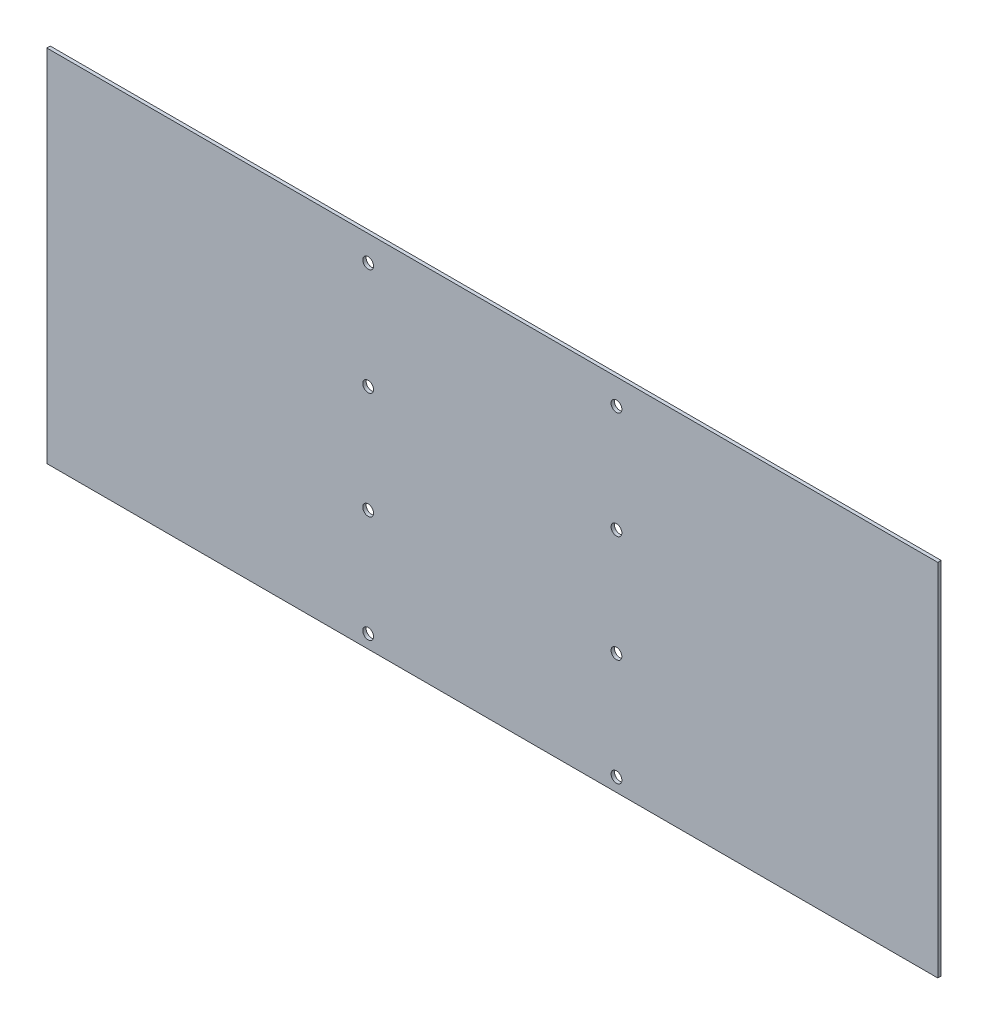
ISO-10303-21;
HEADER;
FILE_DESCRIPTION(('STEP AP214'),'2;1');
FILE_NAME('part.step','',(''),(''),'','','');
FILE_SCHEMA(('AUTOMOTIVE_DESIGN { 1 0 10303 214 1 1 1 1 }'));
ENDSEC;
DATA;
#1=APPLICATION_CONTEXT('core data for automotive mechanical design processes');
#2=APPLICATION_PROTOCOL_DEFINITION('international standard','automotive_design',2000,#1);
#3=PRODUCT_CONTEXT('',#1,'mechanical');
#4=PRODUCT('Part','Part','',(#3));
#5=PRODUCT_RELATED_PRODUCT_CATEGORY('part','',(#4));
#6=PRODUCT_DEFINITION_FORMATION('','',#4);
#7=PRODUCT_DEFINITION_CONTEXT('part definition',#1,'design');
#8=PRODUCT_DEFINITION('design','',#6,#7);
#9=PRODUCT_DEFINITION_SHAPE('','',#8);
#10=(LENGTH_UNIT() NAMED_UNIT(*) SI_UNIT(.MILLI.,.METRE.));
#11=(NAMED_UNIT(*) PLANE_ANGLE_UNIT() SI_UNIT($,.RADIAN.));
#12=(NAMED_UNIT(*) SI_UNIT($,.STERADIAN.) SOLID_ANGLE_UNIT());
#13=UNCERTAINTY_MEASURE_WITH_UNIT(LENGTH_MEASURE(1.E-05),#10,'distance_accuracy_value','');
#14=(GEOMETRIC_REPRESENTATION_CONTEXT(3) GLOBAL_UNCERTAINTY_ASSIGNED_CONTEXT((#13)) GLOBAL_UNIT_ASSIGNED_CONTEXT((#10,
#11,#12)) REPRESENTATION_CONTEXT('',''));
#15=CARTESIAN_POINT('',(0.,0.,0.));
#16=DIRECTION('',(0.,0.,1.));
#17=DIRECTION('',(1.,0.,0.));
#18=AXIS2_PLACEMENT_3D('',#15,#16,#17);
#19=CARTESIAN_POINT('',(-340.928598281418,201.536549165121,-3.175));
#20=DIRECTION('',(-1.,0.,0.));
#21=DIRECTION('',(0.,0.,1.));
#22=AXIS2_PLACEMENT_3D('',#19,#20,#21);
#23=PLANE('',#22);
#24=DIRECTION('',(0.,-1.,0.));
#25=VECTOR('',#24,1.);
#26=CARTESIAN_POINT('',(-340.928598281418,201.536549165121,0.));
#27=LINE('',#26,#25);
#28=CARTESIAN_POINT('',(-340.928598281418,201.536549165121,0.));
#29=VERTEX_POINT('',#28);
#30=CARTESIAN_POINT('',(-340.928598281418,-134.763450834879,0.));
#31=VERTEX_POINT('',#30);
#32=EDGE_CURVE('E105',#29,#31,#27,.T.);
#33=ORIENTED_EDGE('',*,*,#32,.F.);
#34=DIRECTION('',(0.,0.,1.));
#35=VECTOR('',#34,1.);
#36=CARTESIAN_POINT('',(-340.928598281418,201.536549165121,-3.175));
#37=LINE('',#36,#35);
#38=CARTESIAN_POINT('',(-340.928598281418,201.536549165121,-3.175));
#39=VERTEX_POINT('',#38);
#40=EDGE_CURVE('E11',#39,#29,#37,.T.);
#41=ORIENTED_EDGE('',*,*,#40,.F.);
#42=DIRECTION('',(0.,-1.,0.));
#43=VECTOR('',#42,1.);
#44=CARTESIAN_POINT('',(-340.928598281418,201.536549165121,-3.175));
#45=LINE('',#44,#43);
#46=CARTESIAN_POINT('',(-340.928598281418,-134.763450834879,-3.175));
#47=VERTEX_POINT('',#46);
#48=EDGE_CURVE('E98',#39,#47,#45,.T.);
#49=ORIENTED_EDGE('',*,*,#48,.T.);
#50=DIRECTION('',(0.,0.,1.));
#51=VECTOR('',#50,1.);
#52=CARTESIAN_POINT('',(-340.928598281418,-134.763450834879,-3.175));
#53=LINE('',#52,#51);
#54=EDGE_CURVE('E43',#47,#31,#53,.T.);
#55=ORIENTED_EDGE('',*,*,#54,.T.);
#56=EDGE_LOOP('',(#33,#41,#49,#55));
#57=FACE_BOUND('',#56,.T.);
#58=ADVANCED_FACE('F40',(#57),#23,.T.);
#59=CARTESIAN_POINT('',(-340.928598281418,201.536549165121,-3.175));
#60=DIRECTION('',(0.,1.,0.));
#61=DIRECTION('',(0.,0.,1.));
#62=AXIS2_PLACEMENT_3D('',#59,#60,#61);
#63=PLANE('',#62);
#64=DIRECTION('',(-1.,0.,0.));
#65=VECTOR('',#64,1.);
#66=CARTESIAN_POINT('',(-340.928598281418,201.536549165121,0.));
#67=LINE('',#66,#65);
#68=CARTESIAN_POINT('',(491.471401718582,201.536549165121,0.));
#69=VERTEX_POINT('',#68);
#70=EDGE_CURVE('E100',#69,#29,#67,.T.);
#71=ORIENTED_EDGE('',*,*,#70,.F.);
#72=DIRECTION('',(0.,0.,1.));
#73=VECTOR('',#72,1.);
#74=CARTESIAN_POINT('',(491.471401718582,201.536549165121,-3.175));
#75=LINE('',#74,#73);
#76=CARTESIAN_POINT('',(491.471401718582,201.536549165121,-3.175));
#77=VERTEX_POINT('',#76);
#78=EDGE_CURVE('E49',#77,#69,#75,.T.);
#79=ORIENTED_EDGE('',*,*,#78,.F.);
#80=DIRECTION('',(-1.,0.,0.));
#81=VECTOR('',#80,1.);
#82=CARTESIAN_POINT('',(-340.928598281418,201.536549165121,-3.175));
#83=LINE('',#82,#81);
#84=EDGE_CURVE('E95',#77,#39,#83,.T.);
#85=ORIENTED_EDGE('',*,*,#84,.T.);
#86=ORIENTED_EDGE('',*,*,#40,.T.);
#87=EDGE_LOOP('',(#71,#79,#85,#86));
#88=FACE_BOUND('',#87,.T.);
#89=ADVANCED_FACE('F116',(#88),#63,.T.);
#90=CARTESIAN_POINT('',(491.471401718582,201.536549165121,-3.175));
#91=DIRECTION('',(1.,0.,0.));
#92=DIRECTION('',(0.,1.,0.));
#93=AXIS2_PLACEMENT_3D('',#90,#91,#92);
#94=PLANE('',#93);
#95=DIRECTION('',(0.,1.,0.));
#96=VECTOR('',#95,1.);
#97=CARTESIAN_POINT('',(491.471401718582,201.536549165121,0.));
#98=LINE('',#97,#96);
#99=CARTESIAN_POINT('',(491.471401718582,-134.763450834879,0.));
#100=VERTEX_POINT('',#99);
#101=EDGE_CURVE('E90',#100,#69,#98,.T.);
#102=ORIENTED_EDGE('',*,*,#101,.F.);
#103=DIRECTION('',(0.,0.,1.));
#104=VECTOR('',#103,1.);
#105=CARTESIAN_POINT('',(491.471401718582,-134.763450834879,-3.175));
#106=LINE('',#105,#104);
#107=CARTESIAN_POINT('',(491.471401718582,-134.763450834879,-3.175));
#108=VERTEX_POINT('',#107);
#109=EDGE_CURVE('E85',#108,#100,#106,.T.);
#110=ORIENTED_EDGE('',*,*,#109,.F.);
#111=DIRECTION('',(0.,1.,0.));
#112=VECTOR('',#111,1.);
#113=CARTESIAN_POINT('',(491.471401718582,201.536549165121,-3.175));
#114=LINE('',#113,#112);
#115=EDGE_CURVE('E88',#108,#77,#114,.T.);
#116=ORIENTED_EDGE('',*,*,#115,.T.);
#117=ORIENTED_EDGE('',*,*,#78,.T.);
#118=EDGE_LOOP('',(#102,#110,#116,#117));
#119=FACE_BOUND('',#118,.T.);
#120=ADVANCED_FACE('F87',(#119),#94,.T.);
#121=CARTESIAN_POINT('',(-340.928598281418,-134.763450834879,-3.175));
#122=DIRECTION('',(0.,-1.,0.));
#123=DIRECTION('',(0.,0.,-1.));
#124=AXIS2_PLACEMENT_3D('',#121,#122,#123);
#125=PLANE('',#124);
#126=DIRECTION('',(1.,0.,0.));
#127=VECTOR('',#126,1.);
#128=CARTESIAN_POINT('',(-340.928598281418,-134.763450834879,0.));
#129=LINE('',#128,#127);
#130=EDGE_CURVE('E108',#31,#100,#129,.T.);
#131=ORIENTED_EDGE('',*,*,#130,.F.);
#132=ORIENTED_EDGE('',*,*,#54,.F.);
#133=DIRECTION('',(1.,0.,0.));
#134=VECTOR('',#133,1.);
#135=CARTESIAN_POINT('',(-340.928598281418,-134.763450834879,-3.175));
#136=LINE('',#135,#134);
#137=EDGE_CURVE('E94',#47,#108,#136,.T.);
#138=ORIENTED_EDGE('',*,*,#137,.T.);
#139=ORIENTED_EDGE('',*,*,#109,.T.);
#140=EDGE_LOOP('',(#131,#132,#138,#139));
#141=FACE_BOUND('',#140,.T.);
#142=ADVANCED_FACE('F97',(#141),#125,.T.);
#143=CARTESIAN_POINT('',(0.,0.,-3.175));
#144=DIRECTION('',(0.,0.,1.));
#145=DIRECTION('',(1.,0.,0.));
#146=AXIS2_PLACEMENT_3D('',#143,#144,#145);
#147=PLANE('',#146);
#148=CARTESIAN_POINT('',(-40.7285982814178,77.7365491651207,-3.175));
#149=DIRECTION('',(0.,0.,1.));
#150=DIRECTION('',(1.,0.,0.));
#151=AXIS2_PLACEMENT_3D('',#148,#149,#150);
#152=CIRCLE('',#151,5.0419);
#153=CARTESIAN_POINT('',(-35.6866982814178,77.7365491651207,-3.175));
#154=VERTEX_POINT('',#153);
#155=EDGE_CURVE('E173',#154,#154,#152,.T.);
#156=ORIENTED_EDGE('',*,*,#155,.T.);
#157=EDGE_LOOP('',(#156));
#158=FACE_BOUND('',#157,.T.);
#159=CARTESIAN_POINT('',(-40.7285982814178,-22.2634508348793,-3.175));
#160=DIRECTION('',(0.,0.,1.));
#161=DIRECTION('',(1.,0.,0.));
#162=AXIS2_PLACEMENT_3D('',#159,#160,#161);
#163=CIRCLE('',#162,5.0419);
#164=CARTESIAN_POINT('',(-35.6866982814178,-22.2634508348793,-3.175));
#165=VERTEX_POINT('',#164);
#166=EDGE_CURVE('E183',#165,#165,#163,.T.);
#167=ORIENTED_EDGE('',*,*,#166,.T.);
#168=EDGE_LOOP('',(#167));
#169=FACE_BOUND('',#168,.T.);
#170=CARTESIAN_POINT('',(191.271401718582,77.7365491651207,-3.175));
#171=DIRECTION('',(0.,0.,1.));
#172=DIRECTION('',(1.,0.,0.));
#173=AXIS2_PLACEMENT_3D('',#170,#171,#172);
#174=CIRCLE('',#173,5.04189999999999);
#175=CARTESIAN_POINT('',(196.313301718582,77.7365491651207,-3.175));
#176=VERTEX_POINT('',#175);
#177=EDGE_CURVE('E189',#176,#176,#174,.T.);
#178=ORIENTED_EDGE('',*,*,#177,.T.);
#179=EDGE_LOOP('',(#178));
#180=FACE_BOUND('',#179,.T.);
#181=CARTESIAN_POINT('',(191.271401718582,-22.2634508348793,-3.175));
#182=DIRECTION('',(0.,0.,1.));
#183=DIRECTION('',(1.,0.,0.));
#184=AXIS2_PLACEMENT_3D('',#181,#182,#183);
#185=CIRCLE('',#184,5.04189999999999);
#186=CARTESIAN_POINT('',(196.313301718582,-22.2634508348793,-3.175));
#187=VERTEX_POINT('',#186);
#188=EDGE_CURVE('E195',#187,#187,#185,.T.);
#189=ORIENTED_EDGE('',*,*,#188,.T.);
#190=EDGE_LOOP('',(#189));
#191=FACE_BOUND('',#190,.T.);
#192=CARTESIAN_POINT('',(-40.7285982814178,-122.263450834879,-3.175));
#193=DIRECTION('',(0.,0.,1.));
#194=DIRECTION('',(1.,0.,0.));
#195=AXIS2_PLACEMENT_3D('',#192,#193,#194);
#196=CIRCLE('',#195,5.0419);
#197=CARTESIAN_POINT('',(-35.6866982814178,-122.263450834879,-3.175));
#198=VERTEX_POINT('',#197);
#199=EDGE_CURVE('E201',#198,#198,#196,.T.);
#200=ORIENTED_EDGE('',*,*,#199,.T.);
#201=EDGE_LOOP('',(#200));
#202=FACE_BOUND('',#201,.T.);
#203=CARTESIAN_POINT('',(191.271401718582,-122.263450834879,-3.175));
#204=DIRECTION('',(0.,0.,1.));
#205=DIRECTION('',(1.,0.,0.));
#206=AXIS2_PLACEMENT_3D('',#203,#204,#205);
#207=CIRCLE('',#206,5.04189999999999);
#208=CARTESIAN_POINT('',(196.313301718582,-122.263450834879,-3.175));
#209=VERTEX_POINT('',#208);
#210=EDGE_CURVE('E207',#209,#209,#207,.T.);
#211=ORIENTED_EDGE('',*,*,#210,.T.);
#212=EDGE_LOOP('',(#211));
#213=FACE_BOUND('',#212,.T.);
#214=CARTESIAN_POINT('',(191.271401718582,177.736549165121,-3.175));
#215=DIRECTION('',(0.,0.,1.));
#216=DIRECTION('',(1.,0.,0.));
#217=AXIS2_PLACEMENT_3D('',#214,#215,#216);
#218=CIRCLE('',#217,5.04189999999999);
#219=CARTESIAN_POINT('',(196.313301718582,177.736549165121,-3.175));
#220=VERTEX_POINT('',#219);
#221=EDGE_CURVE('E213',#220,#220,#218,.T.);
#222=ORIENTED_EDGE('',*,*,#221,.T.);
#223=EDGE_LOOP('',(#222));
#224=FACE_BOUND('',#223,.T.);
#225=CARTESIAN_POINT('',(-40.7285982814178,177.736549165121,-3.175));
#226=DIRECTION('',(0.,0.,1.));
#227=DIRECTION('',(1.,0.,0.));
#228=AXIS2_PLACEMENT_3D('',#225,#226,#227);
#229=CIRCLE('',#228,5.0419);
#230=CARTESIAN_POINT('',(-35.6866982814178,177.736549165121,-3.175));
#231=VERTEX_POINT('',#230);
#232=EDGE_CURVE('E109',#231,#231,#229,.T.);
#233=ORIENTED_EDGE('',*,*,#232,.T.);
#234=EDGE_LOOP('',(#233));
#235=FACE_BOUND('',#234,.T.);
#236=ORIENTED_EDGE('',*,*,#48,.F.);
#237=ORIENTED_EDGE('',*,*,#84,.F.);
#238=ORIENTED_EDGE('',*,*,#115,.F.);
#239=ORIENTED_EDGE('',*,*,#137,.F.);
#240=EDGE_LOOP('',(#236,#237,#238,#239));
#241=FACE_BOUND('',#240,.T.);
#242=ADVANCED_FACE('F93',(#158,#169,#180,#191,#202,#213,#224,#235,#241),#147,.F.);
#243=CARTESIAN_POINT('',(0.,0.,0.));
#244=DIRECTION('',(0.,0.,1.));
#245=DIRECTION('',(1.,0.,0.));
#246=AXIS2_PLACEMENT_3D('',#243,#244,#245);
#247=PLANE('',#246);
#248=CARTESIAN_POINT('',(-40.7285982814178,77.7365491651207,0.));
#249=DIRECTION('',(0.,0.,1.));
#250=DIRECTION('',(1.,0.,0.));
#251=AXIS2_PLACEMENT_3D('',#248,#249,#250);
#252=CIRCLE('',#251,5.0419);
#253=CARTESIAN_POINT('',(-35.6866982814178,77.7365491651207,0.));
#254=VERTEX_POINT('',#253);
#255=EDGE_CURVE('E176',#254,#254,#252,.T.);
#256=ORIENTED_EDGE('',*,*,#255,.F.);
#257=EDGE_LOOP('',(#256));
#258=FACE_BOUND('',#257,.T.);
#259=CARTESIAN_POINT('',(-40.7285982814178,-22.2634508348793,0.));
#260=DIRECTION('',(0.,0.,1.));
#261=DIRECTION('',(1.,0.,0.));
#262=AXIS2_PLACEMENT_3D('',#259,#260,#261);
#263=CIRCLE('',#262,5.0419);
#264=CARTESIAN_POINT('',(-35.6866982814178,-22.2634508348793,0.));
#265=VERTEX_POINT('',#264);
#266=EDGE_CURVE('E178',#265,#265,#263,.T.);
#267=ORIENTED_EDGE('',*,*,#266,.F.);
#268=EDGE_LOOP('',(#267));
#269=FACE_BOUND('',#268,.T.);
#270=CARTESIAN_POINT('',(191.271401718582,77.7365491651207,0.));
#271=DIRECTION('',(0.,0.,1.));
#272=DIRECTION('',(1.,0.,0.));
#273=AXIS2_PLACEMENT_3D('',#270,#271,#272);
#274=CIRCLE('',#273,5.04189999999999);
#275=CARTESIAN_POINT('',(196.313301718582,77.7365491651207,0.));
#276=VERTEX_POINT('',#275);
#277=EDGE_CURVE('E186',#276,#276,#274,.T.);
#278=ORIENTED_EDGE('',*,*,#277,.F.);
#279=EDGE_LOOP('',(#278));
#280=FACE_BOUND('',#279,.T.);
#281=CARTESIAN_POINT('',(191.271401718582,-22.2634508348793,0.));
#282=DIRECTION('',(0.,0.,1.));
#283=DIRECTION('',(1.,0.,0.));
#284=AXIS2_PLACEMENT_3D('',#281,#282,#283);
#285=CIRCLE('',#284,5.04189999999999);
#286=CARTESIAN_POINT('',(196.313301718582,-22.2634508348793,0.));
#287=VERTEX_POINT('',#286);
#288=EDGE_CURVE('E192',#287,#287,#285,.T.);
#289=ORIENTED_EDGE('',*,*,#288,.F.);
#290=EDGE_LOOP('',(#289));
#291=FACE_BOUND('',#290,.T.);
#292=CARTESIAN_POINT('',(-40.7285982814178,-122.263450834879,0.));
#293=DIRECTION('',(0.,0.,1.));
#294=DIRECTION('',(1.,0.,0.));
#295=AXIS2_PLACEMENT_3D('',#292,#293,#294);
#296=CIRCLE('',#295,5.0419);
#297=CARTESIAN_POINT('',(-35.6866982814178,-122.263450834879,0.));
#298=VERTEX_POINT('',#297);
#299=EDGE_CURVE('E198',#298,#298,#296,.T.);
#300=ORIENTED_EDGE('',*,*,#299,.F.);
#301=EDGE_LOOP('',(#300));
#302=FACE_BOUND('',#301,.T.);
#303=CARTESIAN_POINT('',(191.271401718582,-122.263450834879,0.));
#304=DIRECTION('',(0.,0.,1.));
#305=DIRECTION('',(1.,0.,0.));
#306=AXIS2_PLACEMENT_3D('',#303,#304,#305);
#307=CIRCLE('',#306,5.04189999999999);
#308=CARTESIAN_POINT('',(196.313301718582,-122.263450834879,0.));
#309=VERTEX_POINT('',#308);
#310=EDGE_CURVE('E204',#309,#309,#307,.T.);
#311=ORIENTED_EDGE('',*,*,#310,.F.);
#312=EDGE_LOOP('',(#311));
#313=FACE_BOUND('',#312,.T.);
#314=CARTESIAN_POINT('',(191.271401718582,177.736549165121,0.));
#315=DIRECTION('',(0.,0.,1.));
#316=DIRECTION('',(1.,0.,0.));
#317=AXIS2_PLACEMENT_3D('',#314,#315,#316);
#318=CIRCLE('',#317,5.04189999999999);
#319=CARTESIAN_POINT('',(196.313301718582,177.736549165121,0.));
#320=VERTEX_POINT('',#319);
#321=EDGE_CURVE('E210',#320,#320,#318,.T.);
#322=ORIENTED_EDGE('',*,*,#321,.F.);
#323=EDGE_LOOP('',(#322));
#324=FACE_BOUND('',#323,.T.);
#325=CARTESIAN_POINT('',(-40.7285982814178,177.736549165121,0.));
#326=DIRECTION('',(0.,0.,1.));
#327=DIRECTION('',(1.,0.,0.));
#328=AXIS2_PLACEMENT_3D('',#325,#326,#327);
#329=CIRCLE('',#328,5.0419);
#330=CARTESIAN_POINT('',(-35.6866982814178,177.736549165121,0.));
#331=VERTEX_POINT('',#330);
#332=EDGE_CURVE('E216',#331,#331,#329,.T.);
#333=ORIENTED_EDGE('',*,*,#332,.F.);
#334=EDGE_LOOP('',(#333));
#335=FACE_BOUND('',#334,.T.);
#336=ORIENTED_EDGE('',*,*,#32,.T.);
#337=ORIENTED_EDGE('',*,*,#130,.T.);
#338=ORIENTED_EDGE('',*,*,#101,.T.);
#339=ORIENTED_EDGE('',*,*,#70,.T.);
#340=EDGE_LOOP('',(#336,#337,#338,#339));
#341=FACE_BOUND('',#340,.T.);
#342=ADVANCED_FACE('F115',(#258,#269,#280,#291,#302,#313,#324,#335,#341),#247,.T.);
#343=CARTESIAN_POINT('',(-40.7285982814178,177.736549165121,0.));
#344=DIRECTION('',(0.,0.,1.));
#345=DIRECTION('',(1.,0.,0.));
#346=AXIS2_PLACEMENT_3D('',#343,#344,#345);
#347=CYLINDRICAL_SURFACE('',#346,5.0419);
#348=ORIENTED_EDGE('',*,*,#232,.F.);
#349=EDGE_LOOP('',(#348));
#350=FACE_BOUND('',#349,.T.);
#351=ORIENTED_EDGE('',*,*,#332,.T.);
#352=EDGE_LOOP('',(#351));
#353=FACE_BOUND('',#352,.T.);
#354=ADVANCED_FACE('F134',(#350,#353),#347,.F.);
#355=CARTESIAN_POINT('',(191.271401718582,177.736549165121,0.));
#356=DIRECTION('',(0.,0.,1.));
#357=DIRECTION('',(1.,0.,0.));
#358=AXIS2_PLACEMENT_3D('',#355,#356,#357);
#359=CYLINDRICAL_SURFACE('',#358,5.04189999999999);
#360=ORIENTED_EDGE('',*,*,#221,.F.);
#361=EDGE_LOOP('',(#360));
#362=FACE_BOUND('',#361,.T.);
#363=ORIENTED_EDGE('',*,*,#321,.T.);
#364=EDGE_LOOP('',(#363));
#365=FACE_BOUND('',#364,.T.);
#366=ADVANCED_FACE('F141',(#362,#365),#359,.F.);
#367=CARTESIAN_POINT('',(191.271401718582,-122.263450834879,0.));
#368=DIRECTION('',(0.,0.,1.));
#369=DIRECTION('',(1.,0.,0.));
#370=AXIS2_PLACEMENT_3D('',#367,#368,#369);
#371=CYLINDRICAL_SURFACE('',#370,5.04189999999999);
#372=ORIENTED_EDGE('',*,*,#210,.F.);
#373=EDGE_LOOP('',(#372));
#374=FACE_BOUND('',#373,.T.);
#375=ORIENTED_EDGE('',*,*,#310,.T.);
#376=EDGE_LOOP('',(#375));
#377=FACE_BOUND('',#376,.T.);
#378=ADVANCED_FACE('F145',(#374,#377),#371,.F.);
#379=CARTESIAN_POINT('',(-40.7285982814178,-122.263450834879,0.));
#380=DIRECTION('',(0.,0.,1.));
#381=DIRECTION('',(1.,0.,0.));
#382=AXIS2_PLACEMENT_3D('',#379,#380,#381);
#383=CYLINDRICAL_SURFACE('',#382,5.0419);
#384=ORIENTED_EDGE('',*,*,#199,.F.);
#385=EDGE_LOOP('',(#384));
#386=FACE_BOUND('',#385,.T.);
#387=ORIENTED_EDGE('',*,*,#299,.T.);
#388=EDGE_LOOP('',(#387));
#389=FACE_BOUND('',#388,.T.);
#390=ADVANCED_FACE('F149',(#386,#389),#383,.F.);
#391=CARTESIAN_POINT('',(191.271401718582,-22.2634508348793,0.));
#392=DIRECTION('',(0.,0.,1.));
#393=DIRECTION('',(1.,0.,0.));
#394=AXIS2_PLACEMENT_3D('',#391,#392,#393);
#395=CYLINDRICAL_SURFACE('',#394,5.04189999999999);
#396=ORIENTED_EDGE('',*,*,#188,.F.);
#397=EDGE_LOOP('',(#396));
#398=FACE_BOUND('',#397,.T.);
#399=ORIENTED_EDGE('',*,*,#288,.T.);
#400=EDGE_LOOP('',(#399));
#401=FACE_BOUND('',#400,.T.);
#402=ADVANCED_FACE('F153',(#398,#401),#395,.F.);
#403=CARTESIAN_POINT('',(191.271401718582,77.7365491651207,0.));
#404=DIRECTION('',(0.,0.,1.));
#405=DIRECTION('',(1.,0.,0.));
#406=AXIS2_PLACEMENT_3D('',#403,#404,#405);
#407=CYLINDRICAL_SURFACE('',#406,5.04189999999999);
#408=ORIENTED_EDGE('',*,*,#177,.F.);
#409=EDGE_LOOP('',(#408));
#410=FACE_BOUND('',#409,.T.);
#411=ORIENTED_EDGE('',*,*,#277,.T.);
#412=EDGE_LOOP('',(#411));
#413=FACE_BOUND('',#412,.T.);
#414=ADVANCED_FACE('F157',(#410,#413),#407,.F.);
#415=CARTESIAN_POINT('',(-40.7285982814178,-22.2634508348793,0.));
#416=DIRECTION('',(0.,0.,1.));
#417=DIRECTION('',(1.,0.,0.));
#418=AXIS2_PLACEMENT_3D('',#415,#416,#417);
#419=CYLINDRICAL_SURFACE('',#418,5.0419);
#420=ORIENTED_EDGE('',*,*,#166,.F.);
#421=EDGE_LOOP('',(#420));
#422=FACE_BOUND('',#421,.T.);
#423=ORIENTED_EDGE('',*,*,#266,.T.);
#424=EDGE_LOOP('',(#423));
#425=FACE_BOUND('',#424,.T.);
#426=ADVANCED_FACE('F161',(#422,#425),#419,.F.);
#427=CARTESIAN_POINT('',(-40.7285982814178,77.7365491651207,0.));
#428=DIRECTION('',(0.,0.,1.));
#429=DIRECTION('',(1.,0.,0.));
#430=AXIS2_PLACEMENT_3D('',#427,#428,#429);
#431=CYLINDRICAL_SURFACE('',#430,5.0419);
#432=ORIENTED_EDGE('',*,*,#155,.F.);
#433=EDGE_LOOP('',(#432));
#434=FACE_BOUND('',#433,.T.);
#435=ORIENTED_EDGE('',*,*,#255,.T.);
#436=EDGE_LOOP('',(#435));
#437=FACE_BOUND('',#436,.T.);
#438=ADVANCED_FACE('F165',(#434,#437),#431,.F.);
#439=CLOSED_SHELL('',(#58,#89,#120,#142,#242,#342,#354,#366,#378,#390,#402,#414,#426,#438));
#440=MANIFOLD_SOLID_BREP('B2',#439);
#441=ADVANCED_BREP_SHAPE_REPRESENTATION('',(#18,#440),#14);
#442=SHAPE_DEFINITION_REPRESENTATION(#9,#441);
ENDSEC;
END-ISO-10303-21;
